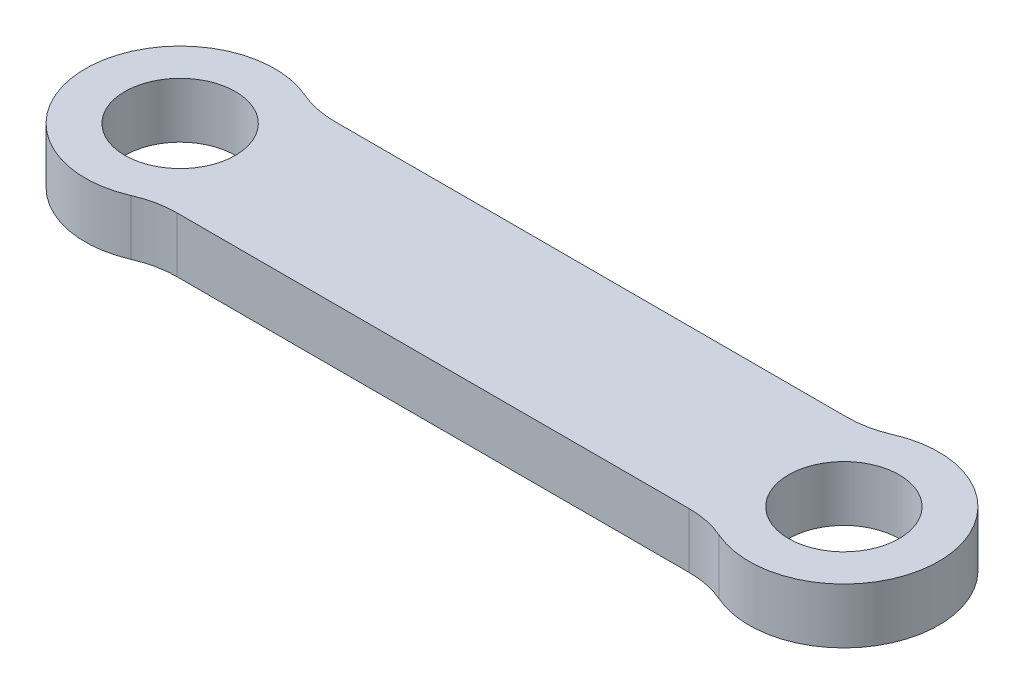
ISO-10303-21;
HEADER;
FILE_DESCRIPTION(('STEP AP214'),'2;1');
FILE_NAME('part.step','',(''),(''),'','','');
FILE_SCHEMA(('AUTOMOTIVE_DESIGN { 1 0 10303 214 1 1 1 1 }'));
ENDSEC;
DATA;
#1=APPLICATION_CONTEXT('core data for automotive mechanical design processes');
#2=APPLICATION_PROTOCOL_DEFINITION('international standard','automotive_design',2000,#1);
#3=PRODUCT_CONTEXT('',#1,'mechanical');
#4=PRODUCT('Part','Part','',(#3));
#5=PRODUCT_RELATED_PRODUCT_CATEGORY('part','',(#4));
#6=PRODUCT_DEFINITION_FORMATION('','',#4);
#7=PRODUCT_DEFINITION_CONTEXT('part definition',#1,'design');
#8=PRODUCT_DEFINITION('design','',#6,#7);
#9=PRODUCT_DEFINITION_SHAPE('','',#8);
#10=(LENGTH_UNIT() NAMED_UNIT(*) SI_UNIT(.MILLI.,.METRE.));
#11=(NAMED_UNIT(*) PLANE_ANGLE_UNIT() SI_UNIT($,.RADIAN.));
#12=(NAMED_UNIT(*) SI_UNIT($,.STERADIAN.) SOLID_ANGLE_UNIT());
#13=UNCERTAINTY_MEASURE_WITH_UNIT(LENGTH_MEASURE(1.E-05),#10,'distance_accuracy_value','');
#14=(GEOMETRIC_REPRESENTATION_CONTEXT(3) GLOBAL_UNCERTAINTY_ASSIGNED_CONTEXT((#13)) GLOBAL_UNIT_ASSIGNED_CONTEXT((#10,
#11,#12)) REPRESENTATION_CONTEXT('',''));
#15=CARTESIAN_POINT('',(0.,0.,0.));
#16=DIRECTION('',(0.,0.,1.));
#17=DIRECTION('',(1.,0.,0.));
#18=AXIS2_PLACEMENT_3D('',#15,#16,#17);
#19=CARTESIAN_POINT('',(21.,1.75,0.));
#20=DIRECTION('',(0.,-1.,0.));
#21=DIRECTION('',(0.,0.,-1.));
#22=AXIS2_PLACEMENT_3D('',#19,#20,#21);
#23=CYLINDRICAL_SURFACE('',#22,3.);
#24=CARTESIAN_POINT('',(21.,1.75,0.));
#25=DIRECTION('',(0.,1.,0.));
#26=DIRECTION('',(0.,0.,1.));
#27=AXIS2_PLACEMENT_3D('',#24,#25,#26);
#28=CIRCLE('',#27,3.);
#29=CARTESIAN_POINT('',(19.8010421191718,1.75,2.75));
#30=VERTEX_POINT('',#29);
#31=CARTESIAN_POINT('',(19.8010421191718,1.75,-2.75));
#32=VERTEX_POINT('',#31);
#33=EDGE_CURVE('E143',#30,#32,#28,.T.);
#34=ORIENTED_EDGE('',*,*,#33,.F.);
#35=DIRECTION('',(0.,-1.,0.));
#36=VECTOR('',#35,1.);
#37=CARTESIAN_POINT('',(19.8010421191718,1.75,2.75));
#38=LINE('',#37,#36);
#39=CARTESIAN_POINT('',(19.8010421191718,0.,2.75));
#40=VERTEX_POINT('',#39);
#41=EDGE_CURVE('E151',#30,#40,#38,.T.);
#42=ORIENTED_EDGE('',*,*,#41,.T.);
#43=CARTESIAN_POINT('',(21.,0.,0.));
#44=DIRECTION('',(0.,1.,0.));
#45=DIRECTION('',(0.,0.,1.));
#46=AXIS2_PLACEMENT_3D('',#43,#44,#45);
#47=CIRCLE('',#46,3.);
#48=CARTESIAN_POINT('',(19.8010421191718,0.,-2.75));
#49=VERTEX_POINT('',#48);
#50=EDGE_CURVE('E168',#40,#49,#47,.T.);
#51=ORIENTED_EDGE('',*,*,#50,.T.);
#52=DIRECTION('',(0.,-1.,0.));
#53=VECTOR('',#52,1.);
#54=CARTESIAN_POINT('',(19.8010421191718,1.75,-2.75));
#55=LINE('',#54,#53);
#56=EDGE_CURVE('E149',#49,#32,#55,.F.);
#57=ORIENTED_EDGE('',*,*,#56,.T.);
#58=EDGE_LOOP('',(#34,#42,#51,#57));
#59=FACE_BOUND('',#58,.T.);
#60=ADVANCED_FACE('F37',(#59),#23,.T.);
#61=CARTESIAN_POINT('',(0.,1.75,-2.5));
#62=DIRECTION('',(0.,0.,-1.));
#63=DIRECTION('',(-1.,0.,0.));
#64=AXIS2_PLACEMENT_3D('',#61,#62,#63);
#65=PLANE('',#64);
#66=DIRECTION('',(1.,0.,0.));
#67=VECTOR('',#66,1.);
#68=CARTESIAN_POINT('',(0.,1.75,-2.5));
#69=LINE('',#68,#67);
#70=CARTESIAN_POINT('',(2.39791576165636,1.75,-2.5));
#71=VERTEX_POINT('',#70);
#72=CARTESIAN_POINT('',(18.6020842383436,1.75,-2.5));
#73=VERTEX_POINT('',#72);
#74=EDGE_CURVE('E175',#71,#73,#69,.T.);
#75=ORIENTED_EDGE('',*,*,#74,.T.);
#76=DIRECTION('',(0.,-1.,0.));
#77=VECTOR('',#76,1.);
#78=CARTESIAN_POINT('',(18.6020842383436,1.75,-2.5));
#79=LINE('',#78,#77);
#80=CARTESIAN_POINT('',(18.6020842383436,0.,-2.5));
#81=VERTEX_POINT('',#80);
#82=EDGE_CURVE('E114',#73,#81,#79,.T.);
#83=ORIENTED_EDGE('',*,*,#82,.T.);
#84=DIRECTION('',(1.,0.,0.));
#85=VECTOR('',#84,1.);
#86=CARTESIAN_POINT('',(0.,0.,-2.5));
#87=LINE('',#86,#85);
#88=CARTESIAN_POINT('',(2.39791576165636,0.,-2.5));
#89=VERTEX_POINT('',#88);
#90=EDGE_CURVE('E137',#89,#81,#87,.T.);
#91=ORIENTED_EDGE('',*,*,#90,.F.);
#92=DIRECTION('',(0.,-1.,0.));
#93=VECTOR('',#92,1.);
#94=CARTESIAN_POINT('',(2.39791576165636,1.75,-2.5));
#95=LINE('',#94,#93);
#96=EDGE_CURVE('E59',#89,#71,#95,.F.);
#97=ORIENTED_EDGE('',*,*,#96,.T.);
#98=EDGE_LOOP('',(#75,#83,#91,#97));
#99=FACE_BOUND('',#98,.T.);
#100=ADVANCED_FACE('F166',(#99),#65,.T.);
#101=CARTESIAN_POINT('',(0.,1.75,0.));
#102=DIRECTION('',(0.,-1.,0.));
#103=DIRECTION('',(0.,0.,-1.));
#104=AXIS2_PLACEMENT_3D('',#101,#102,#103);
#105=CYLINDRICAL_SURFACE('',#104,3.);
#106=CARTESIAN_POINT('',(0.,0.,0.));
#107=DIRECTION('',(0.,1.,0.));
#108=DIRECTION('',(0.,0.,1.));
#109=AXIS2_PLACEMENT_3D('',#106,#107,#108);
#110=CIRCLE('',#109,3.);
#111=CARTESIAN_POINT('',(1.19895788082818,0.,-2.75));
#112=VERTEX_POINT('',#111);
#113=CARTESIAN_POINT('',(1.19895788082818,0.,2.75));
#114=VERTEX_POINT('',#113);
#115=EDGE_CURVE('E132',#112,#114,#110,.T.);
#116=ORIENTED_EDGE('',*,*,#115,.T.);
#117=DIRECTION('',(0.,-1.,0.));
#118=VECTOR('',#117,1.);
#119=CARTESIAN_POINT('',(1.19895788082818,1.75,2.75));
#120=LINE('',#119,#118);
#121=CARTESIAN_POINT('',(1.19895788082818,1.75,2.75));
#122=VERTEX_POINT('',#121);
#123=EDGE_CURVE('E108',#114,#122,#120,.F.);
#124=ORIENTED_EDGE('',*,*,#123,.T.);
#125=CARTESIAN_POINT('',(0.,1.75,0.));
#126=DIRECTION('',(0.,1.,0.));
#127=DIRECTION('',(0.,0.,1.));
#128=AXIS2_PLACEMENT_3D('',#125,#126,#127);
#129=CIRCLE('',#128,3.);
#130=CARTESIAN_POINT('',(1.19895788082818,1.75,-2.75));
#131=VERTEX_POINT('',#130);
#132=EDGE_CURVE('E174',#131,#122,#129,.T.);
#133=ORIENTED_EDGE('',*,*,#132,.F.);
#134=DIRECTION('',(0.,-1.,0.));
#135=VECTOR('',#134,1.);
#136=CARTESIAN_POINT('',(1.19895788082818,1.75,-2.75));
#137=LINE('',#136,#135);
#138=EDGE_CURVE('E124',#131,#112,#137,.T.);
#139=ORIENTED_EDGE('',*,*,#138,.T.);
#140=EDGE_LOOP('',(#116,#124,#133,#139));
#141=FACE_BOUND('',#140,.T.);
#142=ADVANCED_FACE('F177',(#141),#105,.T.);
#143=CARTESIAN_POINT('',(0.,1.75,0.));
#144=DIRECTION('',(0.,-1.,0.));
#145=DIRECTION('',(0.,0.,-1.));
#146=AXIS2_PLACEMENT_3D('',#143,#144,#145);
#147=CYLINDRICAL_SURFACE('',#146,1.75);
#148=CARTESIAN_POINT('',(0.,1.75,0.));
#149=DIRECTION('',(0.,1.,0.));
#150=DIRECTION('',(0.,0.,1.));
#151=AXIS2_PLACEMENT_3D('',#148,#149,#150);
#152=CIRCLE('',#151,1.75);
#153=CARTESIAN_POINT('',(0.,1.75,1.75));
#154=VERTEX_POINT('',#153);
#155=EDGE_CURVE('E179',#154,#154,#152,.T.);
#156=ORIENTED_EDGE('',*,*,#155,.T.);
#157=EDGE_LOOP('',(#156));
#158=FACE_BOUND('',#157,.T.);
#159=CARTESIAN_POINT('',(0.,0.,0.));
#160=DIRECTION('',(0.,1.,0.));
#161=DIRECTION('',(0.,0.,1.));
#162=AXIS2_PLACEMENT_3D('',#159,#160,#161);
#163=CIRCLE('',#162,1.75);
#164=CARTESIAN_POINT('',(0.,0.,1.75));
#165=VERTEX_POINT('',#164);
#166=EDGE_CURVE('E131',#165,#165,#163,.T.);
#167=ORIENTED_EDGE('',*,*,#166,.F.);
#168=EDGE_LOOP('',(#167));
#169=FACE_BOUND('',#168,.T.);
#170=ADVANCED_FACE('F225',(#158,#169),#147,.F.);
#171=CARTESIAN_POINT('',(0.,1.75,2.5));
#172=DIRECTION('',(0.,0.,-1.));
#173=DIRECTION('',(-1.,0.,0.));
#174=AXIS2_PLACEMENT_3D('',#171,#172,#173);
#175=PLANE('',#174);
#176=DIRECTION('',(1.,0.,0.));
#177=VECTOR('',#176,1.);
#178=CARTESIAN_POINT('',(0.,1.75,2.5));
#179=LINE('',#178,#177);
#180=CARTESIAN_POINT('',(2.39791576165636,1.75,2.5));
#181=VERTEX_POINT('',#180);
#182=CARTESIAN_POINT('',(18.6020842383436,1.75,2.5));
#183=VERTEX_POINT('',#182);
#184=EDGE_CURVE('E123',#181,#183,#179,.T.);
#185=ORIENTED_EDGE('',*,*,#184,.F.);
#186=DIRECTION('',(0.,1.,0.));
#187=VECTOR('',#186,1.);
#188=CARTESIAN_POINT('',(2.39791576165636,0.,2.5));
#189=LINE('',#188,#187);
#190=CARTESIAN_POINT('',(2.39791576165636,0.,2.5));
#191=VERTEX_POINT('',#190);
#192=EDGE_CURVE('E107',#181,#191,#189,.F.);
#193=ORIENTED_EDGE('',*,*,#192,.T.);
#194=DIRECTION('',(1.,0.,0.));
#195=VECTOR('',#194,1.);
#196=CARTESIAN_POINT('',(0.,0.,2.5));
#197=LINE('',#196,#195);
#198=CARTESIAN_POINT('',(18.6020842383436,0.,2.5));
#199=VERTEX_POINT('',#198);
#200=EDGE_CURVE('E120',#191,#199,#197,.T.);
#201=ORIENTED_EDGE('',*,*,#200,.T.);
#202=DIRECTION('',(0.,1.,0.));
#203=VECTOR('',#202,1.);
#204=CARTESIAN_POINT('',(18.6020842383436,1.75,2.5));
#205=LINE('',#204,#203);
#206=EDGE_CURVE('E125',#199,#183,#205,.T.);
#207=ORIENTED_EDGE('',*,*,#206,.T.);
#208=EDGE_LOOP('',(#185,#193,#201,#207));
#209=FACE_BOUND('',#208,.T.);
#210=ADVANCED_FACE('F119',(#209),#175,.F.);
#211=CARTESIAN_POINT('',(21.,1.75,0.));
#212=DIRECTION('',(0.,-1.,0.));
#213=DIRECTION('',(0.,0.,-1.));
#214=AXIS2_PLACEMENT_3D('',#211,#212,#213);
#215=CYLINDRICAL_SURFACE('',#214,1.75);
#216=CARTESIAN_POINT('',(21.,1.75,0.));
#217=DIRECTION('',(0.,1.,0.));
#218=DIRECTION('',(0.,0.,1.));
#219=AXIS2_PLACEMENT_3D('',#216,#217,#218);
#220=CIRCLE('',#219,1.75);
#221=CARTESIAN_POINT('',(21.,1.75,1.75));
#222=VERTEX_POINT('',#221);
#223=EDGE_CURVE('E144',#222,#222,#220,.T.);
#224=ORIENTED_EDGE('',*,*,#223,.T.);
#225=EDGE_LOOP('',(#224));
#226=FACE_BOUND('',#225,.T.);
#227=CARTESIAN_POINT('',(21.,0.,0.));
#228=DIRECTION('',(0.,1.,0.));
#229=DIRECTION('',(0.,0.,1.));
#230=AXIS2_PLACEMENT_3D('',#227,#228,#229);
#231=CIRCLE('',#230,1.75);
#232=CARTESIAN_POINT('',(21.,0.,1.75));
#233=VERTEX_POINT('',#232);
#234=EDGE_CURVE('E135',#233,#233,#231,.T.);
#235=ORIENTED_EDGE('',*,*,#234,.F.);
#236=EDGE_LOOP('',(#235));
#237=FACE_BOUND('',#236,.T.);
#238=ADVANCED_FACE('F219',(#226,#237),#215,.F.);
#239=CARTESIAN_POINT('',(0.,1.75,0.));
#240=DIRECTION('',(0.,1.,0.));
#241=DIRECTION('',(0.,0.,1.));
#242=AXIS2_PLACEMENT_3D('',#239,#240,#241);
#243=PLANE('',#242);
#244=ORIENTED_EDGE('',*,*,#184,.T.);
#245=CARTESIAN_POINT('',(18.6020842383436,1.75,5.5));
#246=DIRECTION('',(0.,1.,0.));
#247=DIRECTION('',(0.,0.,1.));
#248=AXIS2_PLACEMENT_3D('',#245,#246,#247);
#249=CIRCLE('',#248,3.);
#250=EDGE_CURVE('E159',#183,#30,#249,.F.);
#251=ORIENTED_EDGE('',*,*,#250,.T.);
#252=ORIENTED_EDGE('',*,*,#33,.T.);
#253=CARTESIAN_POINT('',(18.6020842383436,1.75,-5.5));
#254=DIRECTION('',(0.,1.,0.));
#255=DIRECTION('',(0.,0.,1.));
#256=AXIS2_PLACEMENT_3D('',#253,#254,#255);
#257=CIRCLE('',#256,3.);
#258=EDGE_CURVE('E52',#32,#73,#257,.F.);
#259=ORIENTED_EDGE('',*,*,#258,.T.);
#260=ORIENTED_EDGE('',*,*,#74,.F.);
#261=CARTESIAN_POINT('',(2.39791576165636,1.75,-5.5));
#262=DIRECTION('',(0.,1.,0.));
#263=DIRECTION('',(0.,0.,1.));
#264=AXIS2_PLACEMENT_3D('',#261,#262,#263);
#265=CIRCLE('',#264,3.);
#266=EDGE_CURVE('E11',#71,#131,#265,.F.);
#267=ORIENTED_EDGE('',*,*,#266,.T.);
#268=ORIENTED_EDGE('',*,*,#132,.T.);
#269=CARTESIAN_POINT('',(2.39791576165636,1.75,5.5));
#270=DIRECTION('',(0.,1.,0.));
#271=DIRECTION('',(0.,0.,1.));
#272=AXIS2_PLACEMENT_3D('',#269,#270,#271);
#273=CIRCLE('',#272,3.);
#274=EDGE_CURVE('E113',#122,#181,#273,.F.);
#275=ORIENTED_EDGE('',*,*,#274,.T.);
#276=EDGE_LOOP('',(#244,#251,#252,#259,#260,#267,#268,#275));
#277=FACE_BOUND('',#276,.T.);
#278=ORIENTED_EDGE('',*,*,#155,.F.);
#279=EDGE_LOOP('',(#278));
#280=FACE_BOUND('',#279,.T.);
#281=ORIENTED_EDGE('',*,*,#223,.F.);
#282=EDGE_LOOP('',(#281));
#283=FACE_BOUND('',#282,.T.);
#284=ADVANCED_FACE('F172',(#277,#280,#283),#243,.T.);
#285=CARTESIAN_POINT('',(0.,0.,0.));
#286=DIRECTION('',(0.,1.,0.));
#287=DIRECTION('',(0.,0.,1.));
#288=AXIS2_PLACEMENT_3D('',#285,#286,#287);
#289=PLANE('',#288);
#290=ORIENTED_EDGE('',*,*,#50,.F.);
#291=CARTESIAN_POINT('',(18.6020842383436,0.,5.5));
#292=DIRECTION('',(0.,1.,0.));
#293=DIRECTION('',(0.,0.,1.));
#294=AXIS2_PLACEMENT_3D('',#291,#292,#293);
#295=CIRCLE('',#294,3.);
#296=EDGE_CURVE('E130',#40,#199,#295,.T.);
#297=ORIENTED_EDGE('',*,*,#296,.T.);
#298=ORIENTED_EDGE('',*,*,#200,.F.);
#299=CARTESIAN_POINT('',(2.39791576165636,0.,5.5));
#300=DIRECTION('',(0.,1.,0.));
#301=DIRECTION('',(0.,0.,1.));
#302=AXIS2_PLACEMENT_3D('',#299,#300,#301);
#303=CIRCLE('',#302,3.);
#304=EDGE_CURVE('E103',#191,#114,#303,.T.);
#305=ORIENTED_EDGE('',*,*,#304,.T.);
#306=ORIENTED_EDGE('',*,*,#115,.F.);
#307=CARTESIAN_POINT('',(2.39791576165636,0.,-5.5));
#308=DIRECTION('',(0.,1.,0.));
#309=DIRECTION('',(0.,0.,1.));
#310=AXIS2_PLACEMENT_3D('',#307,#308,#309);
#311=CIRCLE('',#310,3.);
#312=EDGE_CURVE('E45',#112,#89,#311,.T.);
#313=ORIENTED_EDGE('',*,*,#312,.T.);
#314=ORIENTED_EDGE('',*,*,#90,.T.);
#315=CARTESIAN_POINT('',(18.6020842383436,0.,-5.5));
#316=DIRECTION('',(0.,1.,0.));
#317=DIRECTION('',(0.,0.,1.));
#318=AXIS2_PLACEMENT_3D('',#315,#316,#317);
#319=CIRCLE('',#318,3.);
#320=EDGE_CURVE('E161',#81,#49,#319,.T.);
#321=ORIENTED_EDGE('',*,*,#320,.T.);
#322=EDGE_LOOP('',(#290,#297,#298,#305,#306,#313,#314,#321));
#323=FACE_BOUND('',#322,.T.);
#324=ORIENTED_EDGE('',*,*,#166,.T.);
#325=EDGE_LOOP('',(#324));
#326=FACE_BOUND('',#325,.T.);
#327=ORIENTED_EDGE('',*,*,#234,.T.);
#328=EDGE_LOOP('',(#327));
#329=FACE_BOUND('',#328,.T.);
#330=ADVANCED_FACE('F128',(#323,#326,#329),#289,.F.);
#331=CARTESIAN_POINT('',(2.39791576165636,1.75,5.5));
#332=DIRECTION('',(0.,-1.,0.));
#333=DIRECTION('',(0.,0.,-1.));
#334=AXIS2_PLACEMENT_3D('',#331,#332,#333);
#335=CYLINDRICAL_SURFACE('',#334,3.);
#336=ORIENTED_EDGE('',*,*,#274,.F.);
#337=ORIENTED_EDGE('',*,*,#123,.F.);
#338=ORIENTED_EDGE('',*,*,#304,.F.);
#339=ORIENTED_EDGE('',*,*,#192,.F.);
#340=EDGE_LOOP('',(#336,#337,#338,#339));
#341=FACE_BOUND('',#340,.T.);
#342=ADVANCED_FACE('F106',(#341),#335,.F.);
#343=CARTESIAN_POINT('',(18.6020842383436,1.75,5.5));
#344=DIRECTION('',(0.,-1.,0.));
#345=DIRECTION('',(0.,0.,-1.));
#346=AXIS2_PLACEMENT_3D('',#343,#344,#345);
#347=CYLINDRICAL_SURFACE('',#346,3.);
#348=ORIENTED_EDGE('',*,*,#250,.F.);
#349=ORIENTED_EDGE('',*,*,#206,.F.);
#350=ORIENTED_EDGE('',*,*,#296,.F.);
#351=ORIENTED_EDGE('',*,*,#41,.F.);
#352=EDGE_LOOP('',(#348,#349,#350,#351));
#353=FACE_BOUND('',#352,.T.);
#354=ADVANCED_FACE('F196',(#353),#347,.F.);
#355=CARTESIAN_POINT('',(18.6020842383436,1.75,-5.5));
#356=DIRECTION('',(0.,-1.,0.));
#357=DIRECTION('',(0.,0.,-1.));
#358=AXIS2_PLACEMENT_3D('',#355,#356,#357);
#359=CYLINDRICAL_SURFACE('',#358,3.);
#360=ORIENTED_EDGE('',*,*,#258,.F.);
#361=ORIENTED_EDGE('',*,*,#56,.F.);
#362=ORIENTED_EDGE('',*,*,#320,.F.);
#363=ORIENTED_EDGE('',*,*,#82,.F.);
#364=EDGE_LOOP('',(#360,#361,#362,#363));
#365=FACE_BOUND('',#364,.T.);
#366=ADVANCED_FACE('F194',(#365),#359,.F.);
#367=CARTESIAN_POINT('',(2.39791576165636,1.75,-5.5));
#368=DIRECTION('',(0.,-1.,0.));
#369=DIRECTION('',(0.,0.,-1.));
#370=AXIS2_PLACEMENT_3D('',#367,#368,#369);
#371=CYLINDRICAL_SURFACE('',#370,3.);
#372=ORIENTED_EDGE('',*,*,#266,.F.);
#373=ORIENTED_EDGE('',*,*,#96,.F.);
#374=ORIENTED_EDGE('',*,*,#312,.F.);
#375=ORIENTED_EDGE('',*,*,#138,.F.);
#376=EDGE_LOOP('',(#372,#373,#374,#375));
#377=FACE_BOUND('',#376,.T.);
#378=ADVANCED_FACE('F39',(#377),#371,.F.);
#379=CLOSED_SHELL('',(#60,#100,#142,#170,#210,#238,#284,#330,#342,#354,#366,#378));
#380=MANIFOLD_SOLID_BREP('B2',#379);
#381=ADVANCED_BREP_SHAPE_REPRESENTATION('',(#18,#380),#14);
#382=SHAPE_DEFINITION_REPRESENTATION(#9,#381);
ENDSEC;
END-ISO-10303-21;
